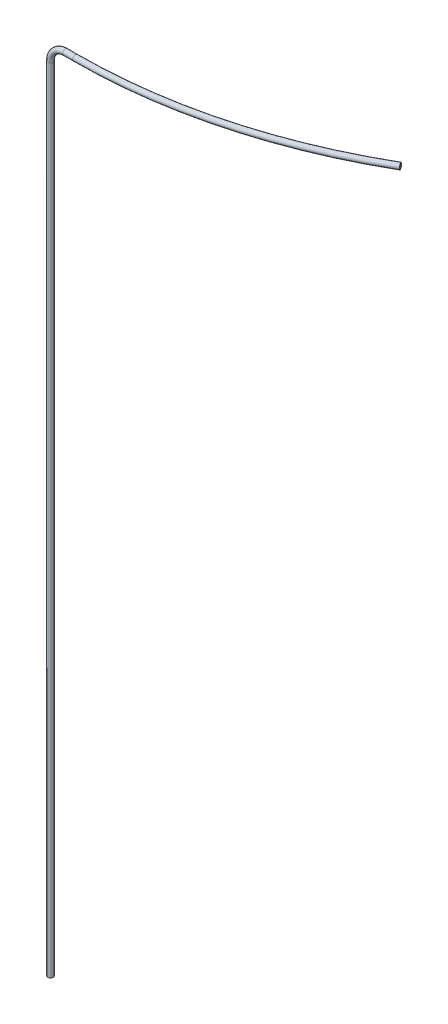
ISO-10303-21;
HEADER;
FILE_DESCRIPTION(('STEP AP214'),'2;1');
FILE_NAME('part.step','',(''),(''),'','','');
FILE_SCHEMA(('AUTOMOTIVE_DESIGN { 1 0 10303 214 1 1 1 1 }'));
ENDSEC;
DATA;
#1=APPLICATION_CONTEXT('core data for automotive mechanical design processes');
#2=APPLICATION_PROTOCOL_DEFINITION('international standard','automotive_design',2000,#1);
#3=PRODUCT_CONTEXT('',#1,'mechanical');
#4=PRODUCT('Part','Part','',(#3));
#5=PRODUCT_RELATED_PRODUCT_CATEGORY('part','',(#4));
#6=PRODUCT_DEFINITION_FORMATION('','',#4);
#7=PRODUCT_DEFINITION_CONTEXT('part definition',#1,'design');
#8=PRODUCT_DEFINITION('design','',#6,#7);
#9=PRODUCT_DEFINITION_SHAPE('','',#8);
#10=(LENGTH_UNIT() NAMED_UNIT(*) SI_UNIT(.MILLI.,.METRE.));
#11=(NAMED_UNIT(*) PLANE_ANGLE_UNIT() SI_UNIT($,.RADIAN.));
#12=(NAMED_UNIT(*) SI_UNIT($,.STERADIAN.) SOLID_ANGLE_UNIT());
#13=UNCERTAINTY_MEASURE_WITH_UNIT(LENGTH_MEASURE(1.E-05),#10,'distance_accuracy_value','');
#14=(GEOMETRIC_REPRESENTATION_CONTEXT(3) GLOBAL_UNCERTAINTY_ASSIGNED_CONTEXT((#13)) GLOBAL_UNIT_ASSIGNED_CONTEXT((#10,
#11,#12)) REPRESENTATION_CONTEXT('',''));
#15=CARTESIAN_POINT('',(0.,0.,0.));
#16=DIRECTION('',(0.,0.,1.));
#17=DIRECTION('',(1.,0.,0.));
#18=AXIS2_PLACEMENT_3D('',#15,#16,#17);
#19=CARTESIAN_POINT('',(0.,-0.371055821718923,-2400.));
#20=DIRECTION('',(0.,-1.,0.));
#21=DIRECTION('',(0.,0.,-1.));
#22=AXIS2_PLACEMENT_3D('',#19,#20,#21);
#23=TOROIDAL_SURFACE('',#22,1100.,6.0000000000001);
#24=CARTESIAN_POINT('',(550.000000000001,-0.371055821718923,-1447.37205583712));
#25=DIRECTION('',(0.866025403784438,0.,-0.500000000000001));
#26=DIRECTION('',(-0.500000000000001,0.,-0.866025403784438));
#27=AXIS2_PLACEMENT_3D('',#24,#25,#26);
#28=CIRCLE('',#27,6.0000000000001);
#29=CARTESIAN_POINT('',(553.000000000001,-0.371055821718923,-1442.17590341441));
#30=VERTEX_POINT('',#29);
#31=EDGE_CURVE('E49',#30,#30,#28,.T.);
#32=CARTESIAN_POINT('',(0.,-0.371055821718923,-1300.));
#33=DIRECTION('',(-1.,0.,0.));
#34=DIRECTION('',(0.,0.,1.));
#35=AXIS2_PLACEMENT_3D('',#32,#33,#34);
#36=CIRCLE('',#35,6.0000000000001);
#37=CARTESIAN_POINT('',(0.,-0.371055821718923,-1294.));
#38=VERTEX_POINT('',#37);
#39=EDGE_CURVE('E66',#38,#38,#36,.T.);
#40=CARTESIAN_POINT('',(0.,-0.371055821718923,-2400.));
#41=DIRECTION('',(0.,-1.,0.));
#42=DIRECTION('',(0.,0.,-1.));
#43=AXIS2_PLACEMENT_3D('',#40,#41,#42);
#44=CIRCLE('',#43,1106.);
#45=EDGE_CURVE('',#30,#38,#44,.T.);
#46=ORIENTED_EDGE('',*,*,#31,.F.);
#47=ORIENTED_EDGE('',*,*,#39,.F.);
#48=ORIENTED_EDGE('',*,*,#45,.T.);
#49=ORIENTED_EDGE('',*,*,#45,.F.);
#50=EDGE_LOOP('',(#46,#48,#47,#49));
#51=FACE_BOUND('',#50,.T.);
#52=ADVANCED_FACE('F41',(#51),#23,.T.);
#53=CARTESIAN_POINT('',(0.,-0.371055821718923,-2400.));
#54=DIRECTION('',(0.,-1.,0.));
#55=DIRECTION('',(0.,0.,-1.));
#56=AXIS2_PLACEMENT_3D('',#53,#54,#55);
#57=TOROIDAL_SURFACE('',#56,1100.,3.99999999999999);
#58=CARTESIAN_POINT('',(550.000000000001,-0.371055821718923,-1447.37205583712));
#59=DIRECTION('',(0.866025403784438,0.,-0.500000000000001));
#60=DIRECTION('',(-0.500000000000001,0.,-0.866025403784438));
#61=AXIS2_PLACEMENT_3D('',#58,#59,#60);
#62=CIRCLE('',#61,3.99999999999999);
#63=CARTESIAN_POINT('',(552.000000000001,-0.371055821718923,-1443.90795422198));
#64=VERTEX_POINT('',#63);
#65=EDGE_CURVE('E10',#64,#64,#62,.T.);
#66=CARTESIAN_POINT('',(0.,-0.371055821718923,-1300.));
#67=DIRECTION('',(1.,0.,0.));
#68=DIRECTION('',(0.,0.,-1.));
#69=AXIS2_PLACEMENT_3D('',#66,#67,#68);
#70=CIRCLE('',#69,3.99999999999999);
#71=CARTESIAN_POINT('',(0.,-0.371055821718923,-1296.));
#72=VERTEX_POINT('',#71);
#73=EDGE_CURVE('E54',#72,#72,#70,.T.);
#74=CARTESIAN_POINT('',(0.,-0.371055821718923,-2400.));
#75=DIRECTION('',(0.,-1.,0.));
#76=DIRECTION('',(0.,0.,-1.));
#77=AXIS2_PLACEMENT_3D('',#74,#75,#76);
#78=CIRCLE('',#77,1104.);
#79=EDGE_CURVE('',#64,#72,#78,.T.);
#80=ORIENTED_EDGE('',*,*,#65,.T.);
#81=ORIENTED_EDGE('',*,*,#73,.F.);
#82=ORIENTED_EDGE('',*,*,#79,.T.);
#83=ORIENTED_EDGE('',*,*,#79,.F.);
#84=EDGE_LOOP('',(#80,#82,#81,#83));
#85=FACE_BOUND('',#84,.T.);
#86=ADVANCED_FACE('F43',(#85),#57,.F.);
#87=CARTESIAN_POINT('',(1200.,0.,-321.539030917349));
#88=DIRECTION('',(0.866025403784438,0.,-0.500000000000001));
#89=DIRECTION('',(-0.500000000000001,0.,-0.866025403784438));
#90=AXIS2_PLACEMENT_3D('',#87,#88,#89);
#91=PLANE('',#90);
#92=ORIENTED_EDGE('',*,*,#31,.T.);
#93=EDGE_LOOP('',(#92));
#94=FACE_BOUND('',#93,.T.);
#95=ORIENTED_EDGE('',*,*,#65,.F.);
#96=EDGE_LOOP('',(#95));
#97=FACE_BOUND('',#96,.T.);
#98=ADVANCED_FACE('F103',(#94,#97),#91,.T.);
#99=CARTESIAN_POINT('',(0.,-0.371055821718923,-1300.));
#100=DIRECTION('',(-1.,0.,0.));
#101=DIRECTION('',(0.,0.,1.));
#102=AXIS2_PLACEMENT_3D('',#99,#100,#101);
#103=CYLINDRICAL_SURFACE('',#102,6.0000000000001);
#104=CARTESIAN_POINT('',(-21.3411325230505,-0.371055821718923,-1300.));
#105=DIRECTION('',(-1.,0.,0.));
#106=DIRECTION('',(0.,0.,1.));
#107=AXIS2_PLACEMENT_3D('',#104,#105,#106);
#108=CIRCLE('',#107,6.0000000000001);
#109=CARTESIAN_POINT('',(-21.3411325230505,5.62894417828116,-1300.));
#110=VERTEX_POINT('',#109);
#111=EDGE_CURVE('E67',#110,#110,#108,.T.);
#112=ORIENTED_EDGE('',*,*,#111,.F.);
#113=EDGE_LOOP('',(#112));
#114=FACE_BOUND('',#113,.T.);
#115=ORIENTED_EDGE('',*,*,#39,.T.);
#116=EDGE_LOOP('',(#115));
#117=FACE_BOUND('',#116,.T.);
#118=ADVANCED_FACE('F96',(#114,#117),#103,.T.);
#119=CARTESIAN_POINT('',(-21.3411325230505,-32.7422911892462,-1300.));
#120=DIRECTION('',(0.,0.,1.));
#121=DIRECTION('',(1.,0.,0.));
#122=AXIS2_PLACEMENT_3D('',#119,#120,#121);
#123=TOROIDAL_SURFACE('',#122,32.3712353675273,6.0000000000001);
#124=CARTESIAN_POINT('',(-53.7123678905778,-32.7422911892462,-1300.));
#125=DIRECTION('',(0.,-1.,0.));
#126=DIRECTION('',(0.,0.,1.));
#127=AXIS2_PLACEMENT_3D('',#124,#125,#126);
#128=CIRCLE('',#127,6.0000000000001);
#129=CARTESIAN_POINT('',(-59.7123678905779,-32.7422911892462,-1300.));
#130=VERTEX_POINT('',#129);
#131=EDGE_CURVE('E62',#130,#130,#128,.T.);
#132=CARTESIAN_POINT('',(-21.3411325230505,-32.7422911892462,-1300.));
#133=DIRECTION('',(0.,0.,1.));
#134=DIRECTION('',(1.,0.,0.));
#135=AXIS2_PLACEMENT_3D('',#132,#133,#134);
#136=CIRCLE('',#135,38.3712353675274);
#137=EDGE_CURVE('',#110,#130,#136,.T.);
#138=ORIENTED_EDGE('',*,*,#111,.T.);
#139=ORIENTED_EDGE('',*,*,#131,.F.);
#140=ORIENTED_EDGE('',*,*,#137,.T.);
#141=ORIENTED_EDGE('',*,*,#137,.F.);
#142=EDGE_LOOP('',(#138,#140,#139,#141));
#143=FACE_BOUND('',#142,.T.);
#144=ADVANCED_FACE('F106',(#143),#123,.T.);
#145=CARTESIAN_POINT('',(-53.7123678905778,-32.7422911892462,-1300.));
#146=DIRECTION('',(0.,-1.,0.));
#147=DIRECTION('',(1.,0.,0.));
#148=AXIS2_PLACEMENT_3D('',#145,#146,#147);
#149=CYLINDRICAL_SURFACE('',#148,6.0000000000001);
#150=ORIENTED_EDGE('',*,*,#131,.T.);
#151=EDGE_LOOP('',(#150));
#152=FACE_BOUND('',#151,.T.);
#153=CARTESIAN_POINT('',(-53.712367890578,-1732.74229118925,-1300.));
#154=DIRECTION('',(0.,-1.,0.));
#155=DIRECTION('',(1.,0.,0.));
#156=AXIS2_PLACEMENT_3D('',#153,#154,#155);
#157=CIRCLE('',#156,6.00000000000001);
#158=CARTESIAN_POINT('',(-47.712367890578,-1732.74229118925,-1300.));
#159=VERTEX_POINT('',#158);
#160=EDGE_CURVE('E71',#159,#159,#157,.T.);
#161=ORIENTED_EDGE('',*,*,#160,.F.);
#162=EDGE_LOOP('',(#161));
#163=FACE_BOUND('',#162,.T.);
#164=ADVANCED_FACE('F118',(#152,#163),#149,.T.);
#165=CARTESIAN_POINT('',(0.,-0.371055821718923,-1300.));
#166=DIRECTION('',(-1.,0.,0.));
#167=DIRECTION('',(0.,0.,1.));
#168=AXIS2_PLACEMENT_3D('',#165,#166,#167);
#169=CYLINDRICAL_SURFACE('',#168,3.99999999999999);
#170=CARTESIAN_POINT('',(-21.3411325230505,-0.371055821718923,-1300.));
#171=DIRECTION('',(-1.,0.,0.));
#172=DIRECTION('',(0.,0.,1.));
#173=AXIS2_PLACEMENT_3D('',#170,#171,#172);
#174=CIRCLE('',#173,3.99999999999999);
#175=CARTESIAN_POINT('',(-21.3411325230505,3.62894417828106,-1300.));
#176=VERTEX_POINT('',#175);
#177=EDGE_CURVE('E75',#176,#176,#174,.F.);
#178=ORIENTED_EDGE('',*,*,#177,.F.);
#179=EDGE_LOOP('',(#178));
#180=FACE_BOUND('',#179,.T.);
#181=ORIENTED_EDGE('',*,*,#73,.T.);
#182=EDGE_LOOP('',(#181));
#183=FACE_BOUND('',#182,.T.);
#184=ADVANCED_FACE('F121',(#180,#183),#169,.F.);
#185=CARTESIAN_POINT('',(-21.3411325230505,-32.7422911892462,-1300.));
#186=DIRECTION('',(0.,0.,1.));
#187=DIRECTION('',(1.,0.,0.));
#188=AXIS2_PLACEMENT_3D('',#185,#186,#187);
#189=TOROIDAL_SURFACE('',#188,32.3712353675273,3.99999999999999);
#190=CARTESIAN_POINT('',(-53.7123678905778,-32.7422911892462,-1300.));
#191=DIRECTION('',(0.,-1.,0.));
#192=DIRECTION('',(0.,0.,1.));
#193=AXIS2_PLACEMENT_3D('',#190,#191,#192);
#194=CIRCLE('',#193,3.99999999999999);
#195=CARTESIAN_POINT('',(-57.7123678905778,-32.7422911892462,-1300.));
#196=VERTEX_POINT('',#195);
#197=EDGE_CURVE('E59',#196,#196,#194,.F.);
#198=CARTESIAN_POINT('',(-21.3411325230505,-32.7422911892462,-1300.));
#199=DIRECTION('',(0.,0.,1.));
#200=DIRECTION('',(1.,0.,0.));
#201=AXIS2_PLACEMENT_3D('',#198,#199,#200);
#202=CIRCLE('',#201,36.3712353675273);
#203=EDGE_CURVE('',#176,#196,#202,.T.);
#204=ORIENTED_EDGE('',*,*,#177,.T.);
#205=ORIENTED_EDGE('',*,*,#197,.F.);
#206=ORIENTED_EDGE('',*,*,#203,.T.);
#207=ORIENTED_EDGE('',*,*,#203,.F.);
#208=EDGE_LOOP('',(#204,#206,#205,#207));
#209=FACE_BOUND('',#208,.T.);
#210=ADVANCED_FACE('F100',(#209),#189,.F.);
#211=CARTESIAN_POINT('',(-53.7123678905778,-32.7422911892462,-1300.));
#212=DIRECTION('',(0.,-1.,0.));
#213=DIRECTION('',(1.,0.,0.));
#214=AXIS2_PLACEMENT_3D('',#211,#212,#213);
#215=CYLINDRICAL_SURFACE('',#214,3.99999999999999);
#216=ORIENTED_EDGE('',*,*,#197,.T.);
#217=EDGE_LOOP('',(#216));
#218=FACE_BOUND('',#217,.T.);
#219=CARTESIAN_POINT('',(-53.712367890578,-1732.74229118925,-1300.));
#220=DIRECTION('',(0.,-1.,0.));
#221=DIRECTION('',(1.,0.,0.));
#222=AXIS2_PLACEMENT_3D('',#219,#220,#221);
#223=CIRCLE('',#222,4.00000000000001);
#224=CARTESIAN_POINT('',(-49.712367890578,-1732.74229118925,-1300.));
#225=VERTEX_POINT('',#224);
#226=EDGE_CURVE('E85',#225,#225,#223,.T.);
#227=ORIENTED_EDGE('',*,*,#226,.T.);
#228=EDGE_LOOP('',(#227));
#229=FACE_BOUND('',#228,.T.);
#230=ADVANCED_FACE('F90',(#218,#229),#215,.F.);
#231=CARTESIAN_POINT('',(-53.712367890578,-1732.74229118925,-1300.));
#232=DIRECTION('',(0.,-1.,0.));
#233=DIRECTION('',(1.,0.,0.));
#234=AXIS2_PLACEMENT_3D('',#231,#232,#233);
#235=PLANE('',#234);
#236=ORIENTED_EDGE('',*,*,#160,.T.);
#237=EDGE_LOOP('',(#236));
#238=FACE_BOUND('',#237,.T.);
#239=ORIENTED_EDGE('',*,*,#226,.F.);
#240=EDGE_LOOP('',(#239));
#241=FACE_BOUND('',#240,.T.);
#242=ADVANCED_FACE('F92',(#238,#241),#235,.T.);
#243=CLOSED_SHELL('',(#52,#86,#98,#118,#144,#164,#184,#210,#230,#242));
#244=MANIFOLD_SOLID_BREP('B2',#243);
#245=ADVANCED_BREP_SHAPE_REPRESENTATION('',(#18,#244),#14);
#246=SHAPE_DEFINITION_REPRESENTATION(#9,#245);
ENDSEC;
END-ISO-10303-21;
